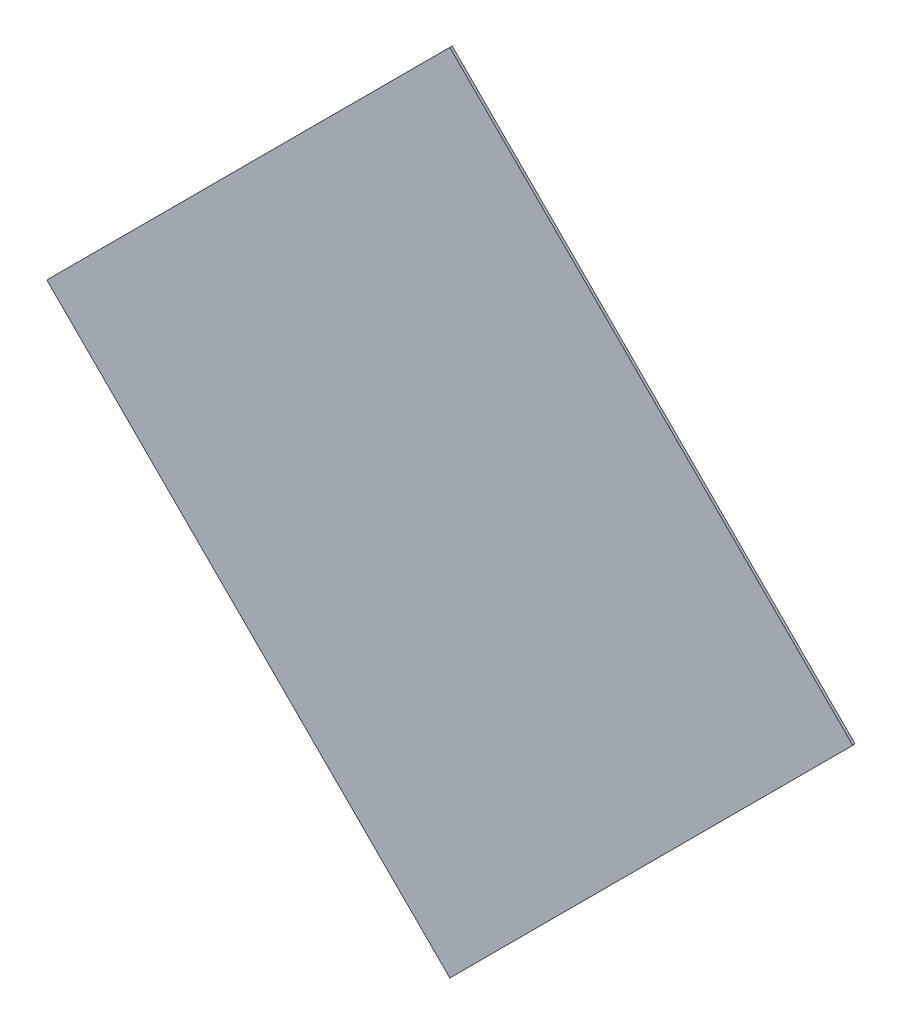
ISO-10303-21;
HEADER;
FILE_DESCRIPTION(('STEP AP214'),'2;1');
FILE_NAME('part.step','',(''),(''),'','','');
FILE_SCHEMA(('AUTOMOTIVE_DESIGN { 1 0 10303 214 1 1 1 1 }'));
ENDSEC;
DATA;
#1=APPLICATION_CONTEXT('core data for automotive mechanical design processes');
#2=APPLICATION_PROTOCOL_DEFINITION('international standard','automotive_design',2000,#1);
#3=PRODUCT_CONTEXT('',#1,'mechanical');
#4=PRODUCT('Part','Part','',(#3));
#5=PRODUCT_RELATED_PRODUCT_CATEGORY('part','',(#4));
#6=PRODUCT_DEFINITION_FORMATION('','',#4);
#7=PRODUCT_DEFINITION_CONTEXT('part definition',#1,'design');
#8=PRODUCT_DEFINITION('design','',#6,#7);
#9=PRODUCT_DEFINITION_SHAPE('','',#8);
#10=(LENGTH_UNIT() NAMED_UNIT(*) SI_UNIT(.MILLI.,.METRE.));
#11=(NAMED_UNIT(*) PLANE_ANGLE_UNIT() SI_UNIT($,.RADIAN.));
#12=(NAMED_UNIT(*) SI_UNIT($,.STERADIAN.) SOLID_ANGLE_UNIT());
#13=UNCERTAINTY_MEASURE_WITH_UNIT(LENGTH_MEASURE(1.E-05),#10,'distance_accuracy_value','');
#14=(GEOMETRIC_REPRESENTATION_CONTEXT(3) GLOBAL_UNCERTAINTY_ASSIGNED_CONTEXT((#13)) GLOBAL_UNIT_ASSIGNED_CONTEXT((#10,
#11,#12)) REPRESENTATION_CONTEXT('',''));
#15=CARTESIAN_POINT('',(0.,0.,0.));
#16=DIRECTION('',(0.,0.,1.));
#17=DIRECTION('',(1.,0.,0.));
#18=AXIS2_PLACEMENT_3D('',#15,#16,#17);
#19=CARTESIAN_POINT('',(0.,94.9,24.));
#20=DIRECTION('',(0.,0.,1.));
#21=DIRECTION('',(1.,0.,0.));
#22=AXIS2_PLACEMENT_3D('',#19,#20,#21);
#23=PLANE('',#22);
#24=DIRECTION('',(-0.707106781186548,-0.707106781186548,0.));
#25=VECTOR('',#24,1.);
#26=CARTESIAN_POINT('',(1.72225,93.17775,24.));
#27=LINE('',#26,#25);
#28=CARTESIAN_POINT('',(3.4445,94.9,24.));
#29=VERTEX_POINT('',#28);
#30=CARTESIAN_POINT('',(0.,91.4555,24.));
#31=VERTEX_POINT('',#30);
#32=EDGE_CURVE('E78',#29,#31,#27,.T.);
#33=ORIENTED_EDGE('',*,*,#32,.T.);
#34=DIRECTION('',(-0.707106781186548,0.707106781186548,0.));
#35=VECTOR('',#34,1.);
#36=CARTESIAN_POINT('',(-1.72225,93.17775,24.));
#37=LINE('',#36,#35);
#38=CARTESIAN_POINT('',(-3.4445,94.9,24.));
#39=VERTEX_POINT('',#38);
#40=EDGE_CURVE('E53',#31,#39,#37,.T.);
#41=ORIENTED_EDGE('',*,*,#40,.T.);
#42=DIRECTION('',(0.707106781186548,0.707106781186548,0.));
#43=VECTOR('',#42,1.);
#44=CARTESIAN_POINT('',(-1.72225,96.62225,24.));
#45=LINE('',#44,#43);
#46=CARTESIAN_POINT('',(0.,98.3445,24.));
#47=VERTEX_POINT('',#46);
#48=EDGE_CURVE('E55',#39,#47,#45,.T.);
#49=ORIENTED_EDGE('',*,*,#48,.T.);
#50=DIRECTION('',(0.707106781186548,-0.707106781186548,0.));
#51=VECTOR('',#50,1.);
#52=CARTESIAN_POINT('',(1.72225,96.62225,24.));
#53=LINE('',#52,#51);
#54=EDGE_CURVE('E18',#47,#29,#53,.T.);
#55=ORIENTED_EDGE('',*,*,#54,.T.);
#56=EDGE_LOOP('',(#33,#41,#49,#55));
#57=FACE_BOUND('',#56,.T.);
#58=ADVANCED_FACE('F15',(#57),#23,.F.);
#59=CARTESIAN_POINT('',(1.72225,96.62225,24.01));
#60=DIRECTION('',(-0.707106781186548,-0.707106781186548,0.));
#61=DIRECTION('',(0.707106781186548,-0.707106781186548,0.));
#62=AXIS2_PLACEMENT_3D('',#59,#60,#61);
#63=PLANE('',#62);
#64=ORIENTED_EDGE('',*,*,#54,.F.);
#65=DIRECTION('',(0.,0.,1.));
#66=VECTOR('',#65,1.);
#67=CARTESIAN_POINT('',(0.,98.3445,24.01));
#68=LINE('',#67,#66);
#69=CARTESIAN_POINT('',(0.,98.3445,24.02));
#70=VERTEX_POINT('',#69);
#71=EDGE_CURVE('E61',#47,#70,#68,.T.);
#72=ORIENTED_EDGE('',*,*,#71,.T.);
#73=DIRECTION('',(-0.707106781186549,0.707106781186546,0.));
#74=VECTOR('',#73,1.);
#75=CARTESIAN_POINT('',(3.4445,94.9,24.02));
#76=LINE('',#75,#74);
#77=CARTESIAN_POINT('',(3.4445,94.9,24.02));
#78=VERTEX_POINT('',#77);
#79=EDGE_CURVE('E81',#78,#70,#76,.T.);
#80=ORIENTED_EDGE('',*,*,#79,.F.);
#81=DIRECTION('',(0.,0.,1.));
#82=VECTOR('',#81,1.);
#83=CARTESIAN_POINT('',(3.44450000000001,94.9,24.01));
#84=LINE('',#83,#82);
#85=EDGE_CURVE('E66',#78,#29,#84,.F.);
#86=ORIENTED_EDGE('',*,*,#85,.T.);
#87=EDGE_LOOP('',(#64,#72,#80,#86));
#88=FACE_BOUND('',#87,.T.);
#89=ADVANCED_FACE('F63',(#88),#63,.F.);
#90=CARTESIAN_POINT('',(-1.72225,96.62225,24.01));
#91=DIRECTION('',(0.707106781186548,-0.707106781186548,0.));
#92=DIRECTION('',(0.707106781186548,0.707106781186548,0.));
#93=AXIS2_PLACEMENT_3D('',#90,#91,#92);
#94=PLANE('',#93);
#95=ORIENTED_EDGE('',*,*,#48,.F.);
#96=DIRECTION('',(0.,0.,1.));
#97=VECTOR('',#96,1.);
#98=CARTESIAN_POINT('',(-3.44450000000001,94.9,24.01));
#99=LINE('',#98,#97);
#100=CARTESIAN_POINT('',(-3.4445,94.9,24.02));
#101=VERTEX_POINT('',#100);
#102=EDGE_CURVE('E73',#39,#101,#99,.T.);
#103=ORIENTED_EDGE('',*,*,#102,.T.);
#104=DIRECTION('',(-0.707106781186549,-0.707106781186546,0.));
#105=VECTOR('',#104,1.);
#106=CARTESIAN_POINT('',(0.,98.3445,24.02));
#107=LINE('',#106,#105);
#108=EDGE_CURVE('E70',#70,#101,#107,.T.);
#109=ORIENTED_EDGE('',*,*,#108,.F.);
#110=ORIENTED_EDGE('',*,*,#71,.F.);
#111=EDGE_LOOP('',(#95,#103,#109,#110));
#112=FACE_BOUND('',#111,.T.);
#113=ADVANCED_FACE('F68',(#112),#94,.F.);
#114=CARTESIAN_POINT('',(-1.72225,93.17775,24.01));
#115=DIRECTION('',(0.707106781186548,0.707106781186548,0.));
#116=DIRECTION('',(-0.707106781186548,0.707106781186548,0.));
#117=AXIS2_PLACEMENT_3D('',#114,#115,#116);
#118=PLANE('',#117);
#119=ORIENTED_EDGE('',*,*,#40,.F.);
#120=DIRECTION('',(0.,0.,1.));
#121=VECTOR('',#120,1.);
#122=CARTESIAN_POINT('',(0.,91.4555,24.01));
#123=LINE('',#122,#121);
#124=CARTESIAN_POINT('',(0.,91.4555,24.02));
#125=VERTEX_POINT('',#124);
#126=EDGE_CURVE('E33',#31,#125,#123,.T.);
#127=ORIENTED_EDGE('',*,*,#126,.T.);
#128=DIRECTION('',(0.707106781186547,-0.707106781186548,0.));
#129=VECTOR('',#128,1.);
#130=CARTESIAN_POINT('',(-3.4445,94.9,24.02));
#131=LINE('',#130,#129);
#132=EDGE_CURVE('E24',#101,#125,#131,.T.);
#133=ORIENTED_EDGE('',*,*,#132,.F.);
#134=ORIENTED_EDGE('',*,*,#102,.F.);
#135=EDGE_LOOP('',(#119,#127,#133,#134));
#136=FACE_BOUND('',#135,.T.);
#137=ADVANCED_FACE('F87',(#136),#118,.F.);
#138=CARTESIAN_POINT('',(1.72225,93.17775,24.01));
#139=DIRECTION('',(-0.707106781186548,0.707106781186548,0.));
#140=DIRECTION('',(-0.707106781186548,-0.707106781186548,0.));
#141=AXIS2_PLACEMENT_3D('',#138,#139,#140);
#142=PLANE('',#141);
#143=ORIENTED_EDGE('',*,*,#32,.F.);
#144=ORIENTED_EDGE('',*,*,#85,.F.);
#145=DIRECTION('',(0.707106781186547,0.707106781186548,0.));
#146=VECTOR('',#145,1.);
#147=CARTESIAN_POINT('',(0.,91.4555,24.02));
#148=LINE('',#147,#146);
#149=EDGE_CURVE('E10',#125,#78,#148,.T.);
#150=ORIENTED_EDGE('',*,*,#149,.F.);
#151=ORIENTED_EDGE('',*,*,#126,.F.);
#152=EDGE_LOOP('',(#143,#144,#150,#151));
#153=FACE_BOUND('',#152,.T.);
#154=ADVANCED_FACE('F89',(#153),#142,.F.);
#155=CARTESIAN_POINT('',(0.,94.9,24.02));
#156=DIRECTION('',(0.,0.,1.));
#157=DIRECTION('',(1.,0.,0.));
#158=AXIS2_PLACEMENT_3D('',#155,#156,#157);
#159=PLANE('',#158);
#160=ORIENTED_EDGE('',*,*,#132,.T.);
#161=ORIENTED_EDGE('',*,*,#149,.T.);
#162=ORIENTED_EDGE('',*,*,#79,.T.);
#163=ORIENTED_EDGE('',*,*,#108,.T.);
#164=EDGE_LOOP('',(#160,#161,#162,#163));
#165=FACE_BOUND('',#164,.T.);
#166=ADVANCED_FACE('F86',(#165),#159,.T.);
#167=CLOSED_SHELL('',(#58,#89,#113,#137,#154,#166));
#168=MANIFOLD_SOLID_BREP('B1',#167);
#169=ADVANCED_BREP_SHAPE_REPRESENTATION('',(#18,#168),#14);
#170=SHAPE_DEFINITION_REPRESENTATION(#9,#169);
ENDSEC;
END-ISO-10303-21;
